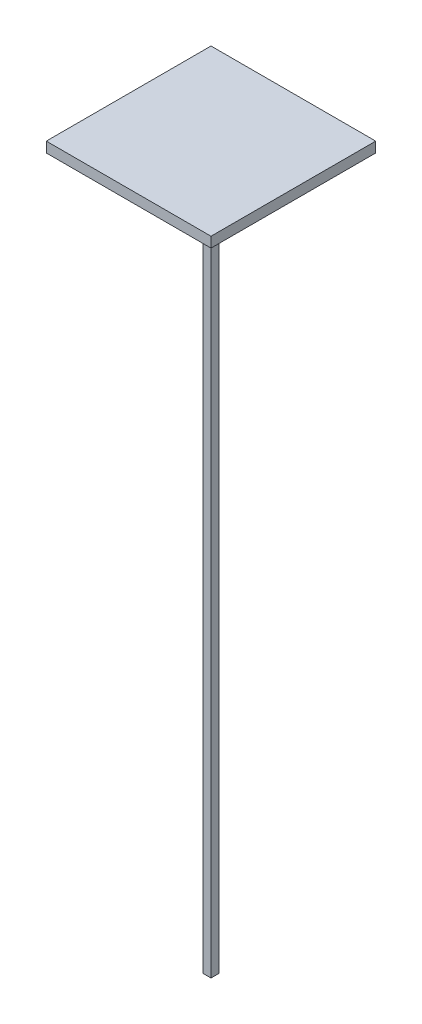
ISO-10303-21;
HEADER;
FILE_DESCRIPTION(('STEP AP214'),'2;1');
FILE_NAME('part.step','',(''),(''),'','','');
FILE_SCHEMA(('AUTOMOTIVE_DESIGN { 1 0 10303 214 1 1 1 1 }'));
ENDSEC;
DATA;
#1=APPLICATION_CONTEXT('core data for automotive mechanical design processes');
#2=APPLICATION_PROTOCOL_DEFINITION('international standard','automotive_design',2000,#1);
#3=PRODUCT_CONTEXT('',#1,'mechanical');
#4=PRODUCT('Part','Part','',(#3));
#5=PRODUCT_RELATED_PRODUCT_CATEGORY('part','',(#4));
#6=PRODUCT_DEFINITION_FORMATION('','',#4);
#7=PRODUCT_DEFINITION_CONTEXT('part definition',#1,'design');
#8=PRODUCT_DEFINITION('design','',#6,#7);
#9=PRODUCT_DEFINITION_SHAPE('','',#8);
#10=(LENGTH_UNIT() NAMED_UNIT(*) SI_UNIT(.MILLI.,.METRE.));
#11=(NAMED_UNIT(*) PLANE_ANGLE_UNIT() SI_UNIT($,.RADIAN.));
#12=(NAMED_UNIT(*) SI_UNIT($,.STERADIAN.) SOLID_ANGLE_UNIT());
#13=UNCERTAINTY_MEASURE_WITH_UNIT(LENGTH_MEASURE(1.E-05),#10,'distance_accuracy_value','');
#14=(GEOMETRIC_REPRESENTATION_CONTEXT(3) GLOBAL_UNCERTAINTY_ASSIGNED_CONTEXT((#13)) GLOBAL_UNIT_ASSIGNED_CONTEXT((#10,
#11,#12)) REPRESENTATION_CONTEXT('',''));
#15=CARTESIAN_POINT('',(0.,0.,0.));
#16=DIRECTION('',(0.,0.,1.));
#17=DIRECTION('',(1.,0.,0.));
#18=AXIS2_PLACEMENT_3D('',#15,#16,#17);
#19=CARTESIAN_POINT('',(0.,345.,0.));
#20=DIRECTION('',(1.,0.,0.));
#21=DIRECTION('',(0.,0.,-1.));
#22=AXIS2_PLACEMENT_3D('',#19,#20,#21);
#23=PLANE('',#22);
#24=DIRECTION('',(0.,0.,1.));
#25=VECTOR('',#24,1.);
#26=CARTESIAN_POINT('',(0.,0.,0.));
#27=LINE('',#26,#25);
#28=CARTESIAN_POINT('',(0.,0.,-4.));
#29=VERTEX_POINT('',#28);
#30=CARTESIAN_POINT('',(0.,0.,0.));
#31=VERTEX_POINT('',#30);
#32=EDGE_CURVE('E130',#29,#31,#27,.T.);
#33=ORIENTED_EDGE('',*,*,#32,.T.);
#34=DIRECTION('',(0.,-1.,0.));
#35=VECTOR('',#34,1.);
#36=CARTESIAN_POINT('',(0.,345.,0.));
#37=LINE('',#36,#35);
#38=CARTESIAN_POINT('',(0.,345.,0.));
#39=VERTEX_POINT('',#38);
#40=EDGE_CURVE('E11',#39,#31,#37,.T.);
#41=ORIENTED_EDGE('',*,*,#40,.F.);
#42=DIRECTION('',(0.,0.,1.));
#43=VECTOR('',#42,1.);
#44=CARTESIAN_POINT('',(0.,345.,0.));
#45=LINE('',#44,#43);
#46=CARTESIAN_POINT('',(0.,345.,-4.));
#47=VERTEX_POINT('',#46);
#48=EDGE_CURVE('E139',#47,#39,#45,.T.);
#49=ORIENTED_EDGE('',*,*,#48,.F.);
#50=DIRECTION('',(0.,-1.,0.));
#51=VECTOR('',#50,1.);
#52=CARTESIAN_POINT('',(0.,345.,-4.));
#53=LINE('',#52,#51);
#54=EDGE_CURVE('E148',#47,#29,#53,.T.);
#55=ORIENTED_EDGE('',*,*,#54,.T.);
#56=EDGE_LOOP('',(#33,#41,#49,#55));
#57=FACE_BOUND('',#56,.T.);
#58=ADVANCED_FACE('F32',(#57),#23,.F.);
#59=CARTESIAN_POINT('',(0.,345.,0.));
#60=DIRECTION('',(0.,0.,-1.));
#61=DIRECTION('',(-1.,0.,0.));
#62=AXIS2_PLACEMENT_3D('',#59,#60,#61);
#63=PLANE('',#62);
#64=DIRECTION('',(1.,0.,0.));
#65=VECTOR('',#64,1.);
#66=CARTESIAN_POINT('',(0.,0.,0.));
#67=LINE('',#66,#65);
#68=CARTESIAN_POINT('',(4.,0.,0.));
#69=VERTEX_POINT('',#68);
#70=EDGE_CURVE('E133',#31,#69,#67,.T.);
#71=ORIENTED_EDGE('',*,*,#70,.T.);
#72=DIRECTION('',(0.,-1.,0.));
#73=VECTOR('',#72,1.);
#74=CARTESIAN_POINT('',(4.,345.,0.));
#75=LINE('',#74,#73);
#76=CARTESIAN_POINT('',(4.,345.,0.));
#77=VERTEX_POINT('',#76);
#78=EDGE_CURVE('E40',#77,#69,#75,.T.);
#79=ORIENTED_EDGE('',*,*,#78,.F.);
#80=DIRECTION('',(1.,0.,0.));
#81=VECTOR('',#80,1.);
#82=CARTESIAN_POINT('',(0.,345.,0.));
#83=LINE('',#82,#81);
#84=EDGE_CURVE('E74',#39,#77,#83,.T.);
#85=ORIENTED_EDGE('',*,*,#84,.F.);
#86=ORIENTED_EDGE('',*,*,#40,.T.);
#87=EDGE_LOOP('',(#71,#79,#85,#86));
#88=FACE_BOUND('',#87,.T.);
#89=ADVANCED_FACE('F174',(#88),#63,.F.);
#90=CARTESIAN_POINT('',(4.,345.,0.));
#91=DIRECTION('',(-1.,0.,0.));
#92=DIRECTION('',(0.,0.,1.));
#93=AXIS2_PLACEMENT_3D('',#90,#91,#92);
#94=PLANE('',#93);
#95=DIRECTION('',(0.,0.,-1.));
#96=VECTOR('',#95,1.);
#97=CARTESIAN_POINT('',(4.,0.,0.));
#98=LINE('',#97,#96);
#99=CARTESIAN_POINT('',(4.,0.,-4.));
#100=VERTEX_POINT('',#99);
#101=EDGE_CURVE('E64',#69,#100,#98,.T.);
#102=ORIENTED_EDGE('',*,*,#101,.T.);
#103=DIRECTION('',(0.,-1.,0.));
#104=VECTOR('',#103,1.);
#105=CARTESIAN_POINT('',(4.,345.,-4.));
#106=LINE('',#105,#104);
#107=CARTESIAN_POINT('',(4.,345.,-4.));
#108=VERTEX_POINT('',#107);
#109=EDGE_CURVE('E48',#108,#100,#106,.T.);
#110=ORIENTED_EDGE('',*,*,#109,.F.);
#111=DIRECTION('',(0.,0.,-1.));
#112=VECTOR('',#111,1.);
#113=CARTESIAN_POINT('',(4.,345.,0.));
#114=LINE('',#113,#112);
#115=EDGE_CURVE('E143',#77,#108,#114,.T.);
#116=ORIENTED_EDGE('',*,*,#115,.F.);
#117=ORIENTED_EDGE('',*,*,#78,.T.);
#118=EDGE_LOOP('',(#102,#110,#116,#117));
#119=FACE_BOUND('',#118,.T.);
#120=ADVANCED_FACE('F154',(#119),#94,.F.);
#121=CARTESIAN_POINT('',(0.,345.,-4.));
#122=DIRECTION('',(0.,0.,1.));
#123=DIRECTION('',(1.,0.,0.));
#124=AXIS2_PLACEMENT_3D('',#121,#122,#123);
#125=PLANE('',#124);
#126=DIRECTION('',(-1.,0.,0.));
#127=VECTOR('',#126,1.);
#128=CARTESIAN_POINT('',(0.,0.,-4.));
#129=LINE('',#128,#127);
#130=EDGE_CURVE('E69',#100,#29,#129,.T.);
#131=ORIENTED_EDGE('',*,*,#130,.T.);
#132=ORIENTED_EDGE('',*,*,#54,.F.);
#133=DIRECTION('',(-1.,0.,0.));
#134=VECTOR('',#133,1.);
#135=CARTESIAN_POINT('',(0.,345.,-4.));
#136=LINE('',#135,#134);
#137=EDGE_CURVE('E146',#108,#47,#136,.T.);
#138=ORIENTED_EDGE('',*,*,#137,.F.);
#139=ORIENTED_EDGE('',*,*,#109,.T.);
#140=EDGE_LOOP('',(#131,#132,#138,#139));
#141=FACE_BOUND('',#140,.T.);
#142=ADVANCED_FACE('F159',(#141),#125,.F.);
#143=CARTESIAN_POINT('',(0.,0.,-4.));
#144=DIRECTION('',(0.,-1.,0.));
#145=DIRECTION('',(0.,0.,-1.));
#146=AXIS2_PLACEMENT_3D('',#143,#144,#145);
#147=PLANE('',#146);
#148=ORIENTED_EDGE('',*,*,#32,.F.);
#149=ORIENTED_EDGE('',*,*,#130,.F.);
#150=ORIENTED_EDGE('',*,*,#101,.F.);
#151=ORIENTED_EDGE('',*,*,#70,.F.);
#152=EDGE_LOOP('',(#148,#149,#150,#151));
#153=FACE_BOUND('',#152,.T.);
#154=ADVANCED_FACE('F157',(#153),#147,.T.);
#155=CARTESIAN_POINT('',(-38.,345.,-42.));
#156=DIRECTION('',(0.,1.,0.));
#157=DIRECTION('',(0.,0.,1.));
#158=AXIS2_PLACEMENT_3D('',#155,#156,#157);
#159=PLANE('',#158);
#160=DIRECTION('',(0.,0.,1.));
#161=VECTOR('',#160,1.);
#162=CARTESIAN_POINT('',(-38.,345.,-42.));
#163=LINE('',#162,#161);
#164=CARTESIAN_POINT('',(-38.,345.,-42.));
#165=VERTEX_POINT('',#164);
#166=CARTESIAN_POINT('',(-38.,345.,38.));
#167=VERTEX_POINT('',#166);
#168=EDGE_CURVE('E129',#165,#167,#163,.T.);
#169=ORIENTED_EDGE('',*,*,#168,.F.);
#170=DIRECTION('',(-1.,0.,0.));
#171=VECTOR('',#170,1.);
#172=CARTESIAN_POINT('',(-38.,345.,-42.));
#173=LINE('',#172,#171);
#174=CARTESIAN_POINT('',(42.,345.,-42.));
#175=VERTEX_POINT('',#174);
#176=EDGE_CURVE('E125',#175,#165,#173,.T.);
#177=ORIENTED_EDGE('',*,*,#176,.F.);
#178=DIRECTION('',(0.,0.,-1.));
#179=VECTOR('',#178,1.);
#180=CARTESIAN_POINT('',(42.,345.,-42.));
#181=LINE('',#180,#179);
#182=CARTESIAN_POINT('',(42.,345.,38.));
#183=VERTEX_POINT('',#182);
#184=EDGE_CURVE('E201',#183,#175,#181,.T.);
#185=ORIENTED_EDGE('',*,*,#184,.F.);
#186=DIRECTION('',(1.,0.,0.));
#187=VECTOR('',#186,1.);
#188=CARTESIAN_POINT('',(-38.,345.,38.));
#189=LINE('',#188,#187);
#190=EDGE_CURVE('E204',#167,#183,#189,.T.);
#191=ORIENTED_EDGE('',*,*,#190,.F.);
#192=EDGE_LOOP('',(#169,#177,#185,#191));
#193=FACE_BOUND('',#192,.T.);
#194=ORIENTED_EDGE('',*,*,#137,.T.);
#195=ORIENTED_EDGE('',*,*,#48,.T.);
#196=ORIENTED_EDGE('',*,*,#84,.T.);
#197=ORIENTED_EDGE('',*,*,#115,.T.);
#198=EDGE_LOOP('',(#194,#195,#196,#197));
#199=FACE_BOUND('',#198,.T.);
#200=ADVANCED_FACE('F161',(#193,#199),#159,.F.);
#201=CARTESIAN_POINT('',(-38.,350.,-42.));
#202=DIRECTION('',(1.,0.,0.));
#203=DIRECTION('',(0.,0.,-1.));
#204=AXIS2_PLACEMENT_3D('',#201,#202,#203);
#205=PLANE('',#204);
#206=ORIENTED_EDGE('',*,*,#168,.T.);
#207=DIRECTION('',(0.,-1.,0.));
#208=VECTOR('',#207,1.);
#209=CARTESIAN_POINT('',(-38.,350.,38.));
#210=LINE('',#209,#208);
#211=CARTESIAN_POINT('',(-38.,350.,38.));
#212=VERTEX_POINT('',#211);
#213=EDGE_CURVE('E109',#212,#167,#210,.T.);
#214=ORIENTED_EDGE('',*,*,#213,.F.);
#215=DIRECTION('',(0.,0.,1.));
#216=VECTOR('',#215,1.);
#217=CARTESIAN_POINT('',(-38.,350.,-42.));
#218=LINE('',#217,#216);
#219=CARTESIAN_POINT('',(-38.,350.,-42.));
#220=VERTEX_POINT('',#219);
#221=EDGE_CURVE('E116',#220,#212,#218,.T.);
#222=ORIENTED_EDGE('',*,*,#221,.F.);
#223=DIRECTION('',(0.,-1.,0.));
#224=VECTOR('',#223,1.);
#225=CARTESIAN_POINT('',(-38.,350.,-42.));
#226=LINE('',#225,#224);
#227=EDGE_CURVE('E198',#220,#165,#226,.T.);
#228=ORIENTED_EDGE('',*,*,#227,.T.);
#229=EDGE_LOOP('',(#206,#214,#222,#228));
#230=FACE_BOUND('',#229,.T.);
#231=ADVANCED_FACE('F127',(#230),#205,.F.);
#232=CARTESIAN_POINT('',(-38.,350.,38.));
#233=DIRECTION('',(0.,0.,-1.));
#234=DIRECTION('',(-1.,0.,0.));
#235=AXIS2_PLACEMENT_3D('',#232,#233,#234);
#236=PLANE('',#235);
#237=ORIENTED_EDGE('',*,*,#190,.T.);
#238=DIRECTION('',(0.,-1.,0.));
#239=VECTOR('',#238,1.);
#240=CARTESIAN_POINT('',(42.,350.,38.));
#241=LINE('',#240,#239);
#242=CARTESIAN_POINT('',(42.,350.,38.));
#243=VERTEX_POINT('',#242);
#244=EDGE_CURVE('E112',#243,#183,#241,.T.);
#245=ORIENTED_EDGE('',*,*,#244,.F.);
#246=DIRECTION('',(1.,0.,0.));
#247=VECTOR('',#246,1.);
#248=CARTESIAN_POINT('',(-38.,350.,38.));
#249=LINE('',#248,#247);
#250=EDGE_CURVE('E105',#212,#243,#249,.T.);
#251=ORIENTED_EDGE('',*,*,#250,.F.);
#252=ORIENTED_EDGE('',*,*,#213,.T.);
#253=EDGE_LOOP('',(#237,#245,#251,#252));
#254=FACE_BOUND('',#253,.T.);
#255=ADVANCED_FACE('F107',(#254),#236,.F.);
#256=CARTESIAN_POINT('',(42.,350.,-42.));
#257=DIRECTION('',(-1.,0.,0.));
#258=DIRECTION('',(0.,0.,1.));
#259=AXIS2_PLACEMENT_3D('',#256,#257,#258);
#260=PLANE('',#259);
#261=ORIENTED_EDGE('',*,*,#184,.T.);
#262=DIRECTION('',(0.,-1.,0.));
#263=VECTOR('',#262,1.);
#264=CARTESIAN_POINT('',(42.,350.,-42.));
#265=LINE('',#264,#263);
#266=CARTESIAN_POINT('',(42.,350.,-42.));
#267=VERTEX_POINT('',#266);
#268=EDGE_CURVE('E135',#267,#175,#265,.T.);
#269=ORIENTED_EDGE('',*,*,#268,.F.);
#270=DIRECTION('',(0.,0.,-1.));
#271=VECTOR('',#270,1.);
#272=CARTESIAN_POINT('',(42.,350.,-42.));
#273=LINE('',#272,#271);
#274=EDGE_CURVE('E115',#243,#267,#273,.T.);
#275=ORIENTED_EDGE('',*,*,#274,.F.);
#276=ORIENTED_EDGE('',*,*,#244,.T.);
#277=EDGE_LOOP('',(#261,#269,#275,#276));
#278=FACE_BOUND('',#277,.T.);
#279=ADVANCED_FACE('F187',(#278),#260,.F.);
#280=CARTESIAN_POINT('',(-38.,350.,-42.));
#281=DIRECTION('',(0.,0.,1.));
#282=DIRECTION('',(1.,0.,0.));
#283=AXIS2_PLACEMENT_3D('',#280,#281,#282);
#284=PLANE('',#283);
#285=ORIENTED_EDGE('',*,*,#176,.T.);
#286=ORIENTED_EDGE('',*,*,#227,.F.);
#287=DIRECTION('',(-1.,0.,0.));
#288=VECTOR('',#287,1.);
#289=CARTESIAN_POINT('',(-38.,350.,-42.));
#290=LINE('',#289,#288);
#291=EDGE_CURVE('E121',#267,#220,#290,.T.);
#292=ORIENTED_EDGE('',*,*,#291,.F.);
#293=ORIENTED_EDGE('',*,*,#268,.T.);
#294=EDGE_LOOP('',(#285,#286,#292,#293));
#295=FACE_BOUND('',#294,.T.);
#296=ADVANCED_FACE('F189',(#295),#284,.F.);
#297=CARTESIAN_POINT('',(-38.,350.,-42.));
#298=DIRECTION('',(0.,1.,0.));
#299=DIRECTION('',(0.,0.,1.));
#300=AXIS2_PLACEMENT_3D('',#297,#298,#299);
#301=PLANE('',#300);
#302=ORIENTED_EDGE('',*,*,#221,.T.);
#303=ORIENTED_EDGE('',*,*,#250,.T.);
#304=ORIENTED_EDGE('',*,*,#274,.T.);
#305=ORIENTED_EDGE('',*,*,#291,.T.);
#306=EDGE_LOOP('',(#302,#303,#304,#305));
#307=FACE_BOUND('',#306,.T.);
#308=ADVANCED_FACE('F119',(#307),#301,.T.);
#309=CLOSED_SHELL('',(#58,#89,#120,#142,#154,#200,#231,#255,#279,#296,#308));
#310=MANIFOLD_SOLID_BREP('B2',#309);
#311=ADVANCED_BREP_SHAPE_REPRESENTATION('',(#18,#310),#14);
#312=SHAPE_DEFINITION_REPRESENTATION(#9,#311);
ENDSEC;
END-ISO-10303-21;
